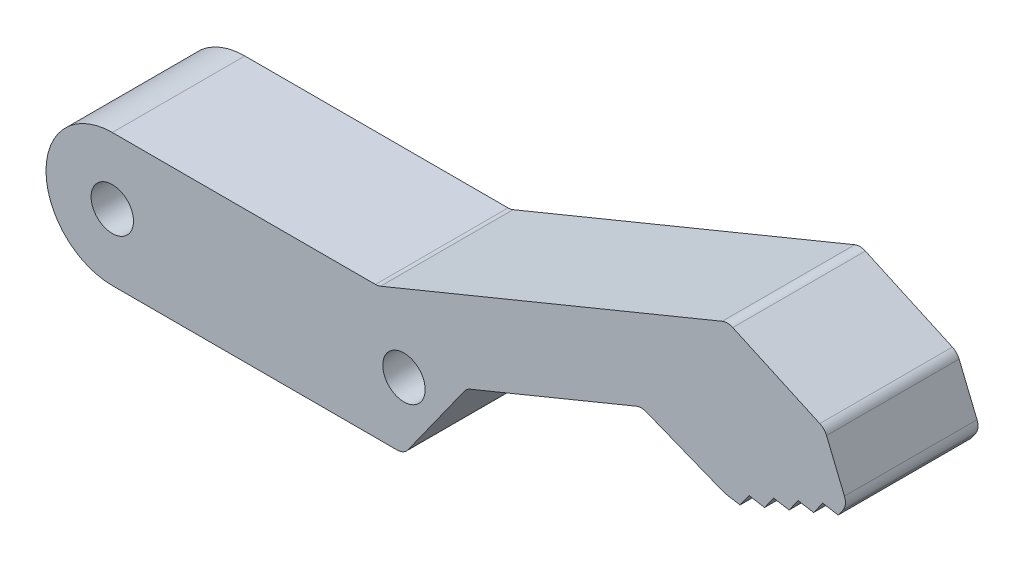
ISO-10303-21;
HEADER;
FILE_DESCRIPTION(('STEP AP214'),'2;1');
FILE_NAME('part.step','',(''),(''),'','','');
FILE_SCHEMA(('AUTOMOTIVE_DESIGN { 1 0 10303 214 1 1 1 1 }'));
ENDSEC;
DATA;
#1=APPLICATION_CONTEXT('core data for automotive mechanical design processes');
#2=APPLICATION_PROTOCOL_DEFINITION('international standard','automotive_design',2000,#1);
#3=PRODUCT_CONTEXT('',#1,'mechanical');
#4=PRODUCT('Part','Part','',(#3));
#5=PRODUCT_RELATED_PRODUCT_CATEGORY('part','',(#4));
#6=PRODUCT_DEFINITION_FORMATION('','',#4);
#7=PRODUCT_DEFINITION_CONTEXT('part definition',#1,'design');
#8=PRODUCT_DEFINITION('design','',#6,#7);
#9=PRODUCT_DEFINITION_SHAPE('','',#8);
#10=(LENGTH_UNIT() NAMED_UNIT(*) SI_UNIT(.MILLI.,.METRE.));
#11=(NAMED_UNIT(*) PLANE_ANGLE_UNIT() SI_UNIT($,.RADIAN.));
#12=(NAMED_UNIT(*) SI_UNIT($,.STERADIAN.) SOLID_ANGLE_UNIT());
#13=UNCERTAINTY_MEASURE_WITH_UNIT(LENGTH_MEASURE(1.E-05),#10,'distance_accuracy_value','');
#14=(GEOMETRIC_REPRESENTATION_CONTEXT(3) GLOBAL_UNCERTAINTY_ASSIGNED_CONTEXT((#13)) GLOBAL_UNIT_ASSIGNED_CONTEXT((#10,
#11,#12)) REPRESENTATION_CONTEXT('',''));
#15=CARTESIAN_POINT('',(0.,0.,0.));
#16=DIRECTION('',(0.,0.,1.));
#17=DIRECTION('',(1.,0.,0.));
#18=AXIS2_PLACEMENT_3D('',#15,#16,#17);
#19=CARTESIAN_POINT('',(16.9314341640704,-12.0952117619831,10.));
#20=DIRECTION('',(0.813703233651604,-0.581280523968353,0.));
#21=DIRECTION('',(0.581280523968353,0.813703233651604,0.));
#22=AXIS2_PLACEMENT_3D('',#19,#20,#21);
#23=PLANE('',#22);
#24=DIRECTION('',(-0.581280523968353,-0.813703233651604,0.));
#25=VECTOR('',#24,1.);
#26=CARTESIAN_POINT('',(16.9314341640704,-12.0952117619831,0.));
#27=LINE('',#26,#25);
#28=CARTESIAN_POINT('',(26.562618493048,1.38696338278467,0.));
#29=VERTEX_POINT('',#28);
#30=CARTESIAN_POINT('',(22.2991182366711,-4.58128052396835,0.));
#31=VERTEX_POINT('',#30);
#32=EDGE_CURVE('E320',#29,#31,#27,.T.);
#33=ORIENTED_EDGE('',*,*,#32,.F.);
#34=DIRECTION('',(0.,0.,-1.));
#35=VECTOR('',#34,1.);
#36=CARTESIAN_POINT('',(26.562618493048,1.38696338278467,10.));
#37=LINE('',#36,#35);
#38=CARTESIAN_POINT('',(26.562618493048,1.38696338278467,10.));
#39=VERTEX_POINT('',#38);
#40=EDGE_CURVE('E306',#29,#39,#37,.F.);
#41=ORIENTED_EDGE('',*,*,#40,.T.);
#42=DIRECTION('',(-0.581280523968353,-0.813703233651604,0.));
#43=VECTOR('',#42,1.);
#44=CARTESIAN_POINT('',(16.9314341640704,-12.0952117619831,10.));
#45=LINE('',#44,#43);
#46=CARTESIAN_POINT('',(22.2991182366711,-4.58128052396835,10.));
#47=VERTEX_POINT('',#46);
#48=EDGE_CURVE('E338',#39,#47,#45,.T.);
#49=ORIENTED_EDGE('',*,*,#48,.T.);
#50=DIRECTION('',(0.,0.,-1.));
#51=VECTOR('',#50,1.);
#52=CARTESIAN_POINT('',(22.2991182366711,-4.58128052396835,0.));
#53=LINE('',#52,#51);
#54=EDGE_CURVE('E303',#47,#31,#53,.T.);
#55=ORIENTED_EDGE('',*,*,#54,.T.);
#56=EDGE_LOOP('',(#33,#41,#49,#55));
#57=FACE_BOUND('',#56,.T.);
#58=ADVANCED_FACE('F39',(#57),#23,.T.);
#59=CARTESIAN_POINT('',(3.29500338314039,-8.01412070884607,10.));
#60=DIRECTION('',(0.380263412733207,-0.924878228166549,0.));
#61=DIRECTION('',(0.924878228166549,0.380263412733207,0.));
#62=AXIS2_PLACEMENT_3D('',#59,#60,#61);
#63=PLANE('',#62);
#64=DIRECTION('',(-0.924878228166549,-0.380263412733207,0.));
#65=VECTOR('',#64,1.);
#66=CARTESIAN_POINT('',(3.29500338314039,-8.01412070884607,0.));
#67=LINE('',#66,#65);
#68=CARTESIAN_POINT('',(39.5264893293259,6.88244413040183,0.));
#69=VERTEX_POINT('',#68);
#70=CARTESIAN_POINT('',(26.9960583139664,1.73056108698286,0.));
#71=VERTEX_POINT('',#70);
#72=EDGE_CURVE('E322',#69,#71,#67,.T.);
#73=ORIENTED_EDGE('',*,*,#72,.F.);
#74=DIRECTION('',(0.,0.,-1.));
#75=VECTOR('',#74,1.);
#76=CARTESIAN_POINT('',(39.5264893293259,6.88244413040184,10.));
#77=LINE('',#76,#75);
#78=CARTESIAN_POINT('',(39.5264893293259,6.88244413040183,10.));
#79=VERTEX_POINT('',#78);
#80=EDGE_CURVE('E301',#69,#79,#77,.F.);
#81=ORIENTED_EDGE('',*,*,#80,.T.);
#82=DIRECTION('',(-0.924878228166549,-0.380263412733207,0.));
#83=VECTOR('',#82,1.);
#84=CARTESIAN_POINT('',(3.29500338314039,-8.01412070884607,10.));
#85=LINE('',#84,#83);
#86=CARTESIAN_POINT('',(26.9960583139664,1.73056108698286,10.));
#87=VERTEX_POINT('',#86);
#88=EDGE_CURVE('E336',#79,#87,#85,.T.);
#89=ORIENTED_EDGE('',*,*,#88,.T.);
#90=DIRECTION('',(0.,0.,-1.));
#91=VECTOR('',#90,1.);
#92=CARTESIAN_POINT('',(26.9960583139664,1.73056108698286,0.));
#93=LINE('',#92,#91);
#94=EDGE_CURVE('E298',#87,#71,#93,.T.);
#95=ORIENTED_EDGE('',*,*,#94,.T.);
#96=EDGE_LOOP('',(#73,#81,#89,#95));
#97=FACE_BOUND('',#96,.T.);
#98=ADVANCED_FACE('F340',(#97),#63,.T.);
#99=CARTESIAN_POINT('',(7.84369243763637,19.7605066346556,10.));
#100=DIRECTION('',(-0.368935795459582,-0.929454882621317,0.));
#101=DIRECTION('',(0.929454882621317,-0.368935795459582,0.));
#102=AXIS2_PLACEMENT_3D('',#99,#100,#101);
#103=PLANE('',#102);
#104=DIRECTION('',(-0.929454882621317,0.368935795459582,0.));
#105=VECTOR('',#104,1.);
#106=CARTESIAN_POINT('',(7.84369243763637,19.7605066346556,0.));
#107=LINE('',#106,#105);
#108=CARTESIAN_POINT('',(46.0908425261849,4.57876623410547,0.));
#109=VERTEX_POINT('',#108);
#110=CARTESIAN_POINT('',(40.2756885375187,6.8870207848566,0.));
#111=VERTEX_POINT('',#110);
#112=EDGE_CURVE('E389',#109,#111,#107,.T.);
#113=ORIENTED_EDGE('',*,*,#112,.F.);
#114=DIRECTION('',(0.,0.,-1.));
#115=VECTOR('',#114,1.);
#116=CARTESIAN_POINT('',(46.0908425261848,4.57876623410547,10.));
#117=LINE('',#116,#115);
#118=CARTESIAN_POINT('',(46.0908425261849,4.57876623410547,10.));
#119=VERTEX_POINT('',#118);
#120=EDGE_CURVE('E267',#109,#119,#117,.F.);
#121=ORIENTED_EDGE('',*,*,#120,.T.);
#122=DIRECTION('',(-0.929454882621317,0.368935795459582,0.));
#123=VECTOR('',#122,1.);
#124=CARTESIAN_POINT('',(7.84369243763637,19.7605066346556,10.));
#125=LINE('',#124,#123);
#126=CARTESIAN_POINT('',(40.2756885375187,6.8870207848566,10.));
#127=VERTEX_POINT('',#126);
#128=EDGE_CURVE('E232',#119,#127,#125,.T.);
#129=ORIENTED_EDGE('',*,*,#128,.T.);
#130=DIRECTION('',(0.,0.,-1.));
#131=VECTOR('',#130,1.);
#132=CARTESIAN_POINT('',(40.2756885375187,6.8870207848566,0.));
#133=LINE('',#132,#131);
#134=EDGE_CURVE('E264',#127,#111,#133,.T.);
#135=ORIENTED_EDGE('',*,*,#134,.T.);
#136=EDGE_LOOP('',(#113,#121,#129,#135));
#137=FACE_BOUND('',#136,.T.);
#138=ADVANCED_FACE('F537',(#137),#103,.T.);
#139=CARTESIAN_POINT('',(2.04998063607053,12.0493696274544,10.));
#140=DIRECTION('',(0.167721751487352,0.985834374567054,0.));
#141=DIRECTION('',(-0.985834374567054,0.167721751487352,0.));
#142=AXIS2_PLACEMENT_3D('',#139,#140,#141);
#143=PLANE('',#142);
#144=DIRECTION('',(0.985834374567054,-0.167721751487352,0.));
#145=VECTOR('',#144,1.);
#146=CARTESIAN_POINT('',(2.04998063607053,12.0493696274544,10.));
#147=LINE('',#146,#145);
#148=CARTESIAN_POINT('',(46.2920565701571,4.52238674215974,10.));
#149=VERTEX_POINT('',#148);
#150=CARTESIAN_POINT('',(47.3510308865052,4.3422215625919,10.));
#151=VERTEX_POINT('',#150);
#152=EDGE_CURVE('E219',#149,#151,#147,.T.);
#153=ORIENTED_EDGE('',*,*,#152,.F.);
#154=DIRECTION('',(0.,0.,-1.));
#155=VECTOR('',#154,1.);
#156=CARTESIAN_POINT('',(46.2920565701571,4.52238674215974,0.));
#157=LINE('',#156,#155);
#158=CARTESIAN_POINT('',(46.2920565701571,4.52238674215974,0.));
#159=VERTEX_POINT('',#158);
#160=EDGE_CURVE('E247',#149,#159,#157,.T.);
#161=ORIENTED_EDGE('',*,*,#160,.T.);
#162=DIRECTION('',(0.985834374567054,-0.167721751487352,0.));
#163=VECTOR('',#162,1.);
#164=CARTESIAN_POINT('',(2.04998063607053,12.0493696274544,0.));
#165=LINE('',#164,#163);
#166=CARTESIAN_POINT('',(47.3510308865052,4.3422215625919,0.));
#167=VERTEX_POINT('',#166);
#168=EDGE_CURVE('E245',#159,#167,#165,.T.);
#169=ORIENTED_EDGE('',*,*,#168,.T.);
#170=DIRECTION('',(0.,0.,-1.));
#171=VECTOR('',#170,1.);
#172=CARTESIAN_POINT('',(47.3510308865052,4.3422215625919,10.));
#173=LINE('',#172,#171);
#174=EDGE_CURVE('E238',#151,#167,#173,.T.);
#175=ORIENTED_EDGE('',*,*,#174,.F.);
#176=EDGE_LOOP('',(#153,#161,#169,#175));
#177=FACE_BOUND('',#176,.T.);
#178=ADVANCED_FACE('F243',(#177),#143,.F.);
#179=CARTESIAN_POINT('',(29.2140395089282,-20.9496267653803,10.));
#180=DIRECTION('',(-0.812647209633238,0.582755963225871,0.));
#181=DIRECTION('',(-0.582755963225871,-0.812647209633238,0.));
#182=AXIS2_PLACEMENT_3D('',#179,#180,#181);
#183=PLANE('',#182);
#184=DIRECTION('',(0.582755963225871,0.812647209633238,0.));
#185=VECTOR('',#184,1.);
#186=CARTESIAN_POINT('',(29.2140395089282,-20.9496267653803,0.));
#187=LINE('',#186,#185);
#188=CARTESIAN_POINT('',(48.0382444817135,5.3005338679292,0.));
#189=VERTEX_POINT('',#188);
#190=EDGE_CURVE('E393',#167,#189,#187,.T.);
#191=ORIENTED_EDGE('',*,*,#190,.T.);
#192=DIRECTION('',(0.,0.,-1.));
#193=VECTOR('',#192,1.);
#194=CARTESIAN_POINT('',(48.0382444817135,5.3005338679292,10.));
#195=LINE('',#194,#193);
#196=CARTESIAN_POINT('',(48.0382444817135,5.3005338679292,10.));
#197=VERTEX_POINT('',#196);
#198=EDGE_CURVE('E240',#197,#189,#195,.T.);
#199=ORIENTED_EDGE('',*,*,#198,.F.);
#200=DIRECTION('',(0.582755963225871,0.812647209633238,0.));
#201=VECTOR('',#200,1.);
#202=CARTESIAN_POINT('',(29.2140395089282,-20.9496267653803,10.));
#203=LINE('',#202,#201);
#204=EDGE_CURVE('E224',#151,#197,#203,.T.);
#205=ORIENTED_EDGE('',*,*,#204,.F.);
#206=ORIENTED_EDGE('',*,*,#174,.T.);
#207=EDGE_LOOP('',(#191,#199,#205,#206));
#208=FACE_BOUND('',#207,.T.);
#209=ADVANCED_FACE('F237',(#208),#183,.F.);
#210=CARTESIAN_POINT('',(2.22776533707793,13.0943519745326,10.));
#211=DIRECTION('',(0.167721751487345,0.985834374567055,0.));
#212=DIRECTION('',(-0.985834374567056,0.167721751487345,0.));
#213=AXIS2_PLACEMENT_3D('',#210,#211,#212);
#214=PLANE('',#213);
#215=DIRECTION('',(0.985834374567055,-0.167721751487345,0.));
#216=VECTOR('',#215,1.);
#217=CARTESIAN_POINT('',(2.22776533707793,13.0943519745326,0.));
#218=LINE('',#217,#216);
#219=CARTESIAN_POINT('',(49.2007873428382,5.10274838805831,0.));
#220=VERTEX_POINT('',#219);
#221=EDGE_CURVE('E395',#189,#220,#218,.T.);
#222=ORIENTED_EDGE('',*,*,#221,.T.);
#223=DIRECTION('',(0.,0.,-1.));
#224=VECTOR('',#223,1.);
#225=CARTESIAN_POINT('',(49.2007873428382,5.10274838805831,10.));
#226=LINE('',#225,#224);
#227=CARTESIAN_POINT('',(49.2007873428382,5.10274838805831,10.));
#228=VERTEX_POINT('',#227);
#229=EDGE_CURVE('E251',#228,#220,#226,.T.);
#230=ORIENTED_EDGE('',*,*,#229,.F.);
#231=DIRECTION('',(0.985834374567055,-0.167721751487345,0.));
#232=VECTOR('',#231,1.);
#233=CARTESIAN_POINT('',(2.22776533707793,13.0943519745326,10.));
#234=LINE('',#233,#232);
#235=EDGE_CURVE('E241',#197,#228,#234,.T.);
#236=ORIENTED_EDGE('',*,*,#235,.F.);
#237=ORIENTED_EDGE('',*,*,#198,.T.);
#238=EDGE_LOOP('',(#222,#230,#236,#237));
#239=FACE_BOUND('',#238,.T.);
#240=ADVANCED_FACE('F462',(#239),#214,.F.);
#241=CARTESIAN_POINT('',(30.0754438283324,-21.5673468509608,10.));
#242=DIRECTION('',(-0.812647209633237,0.582755963225872,0.));
#243=DIRECTION('',(-0.582755963225872,-0.812647209633237,0.));
#244=AXIS2_PLACEMENT_3D('',#241,#242,#243);
#245=PLANE('',#244);
#246=DIRECTION('',(0.582755963225872,0.812647209633237,0.));
#247=VECTOR('',#246,1.);
#248=CARTESIAN_POINT('',(30.0754438283324,-21.5673468509608,0.));
#249=LINE('',#248,#247);
#250=CARTESIAN_POINT('',(49.8880009380465,6.06106069339562,0.));
#251=VERTEX_POINT('',#250);
#252=EDGE_CURVE('E398',#220,#251,#249,.T.);
#253=ORIENTED_EDGE('',*,*,#252,.T.);
#254=DIRECTION('',(0.,0.,-1.));
#255=VECTOR('',#254,1.);
#256=CARTESIAN_POINT('',(49.8880009380465,6.06106069339562,10.));
#257=LINE('',#256,#255);
#258=CARTESIAN_POINT('',(49.8880009380465,6.06106069339562,10.));
#259=VERTEX_POINT('',#258);
#260=EDGE_CURVE('E454',#259,#251,#257,.T.);
#261=ORIENTED_EDGE('',*,*,#260,.F.);
#262=DIRECTION('',(0.582755963225872,0.812647209633237,0.));
#263=VECTOR('',#262,1.);
#264=CARTESIAN_POINT('',(30.0754438283324,-21.5673468509608,10.));
#265=LINE('',#264,#263);
#266=EDGE_CURVE('E350',#228,#259,#265,.T.);
#267=ORIENTED_EDGE('',*,*,#266,.F.);
#268=ORIENTED_EDGE('',*,*,#229,.T.);
#269=EDGE_LOOP('',(#253,#261,#267,#268));
#270=FACE_BOUND('',#269,.T.);
#271=ADVANCED_FACE('F459',(#270),#245,.F.);
#272=CARTESIAN_POINT('',(2.40555003808549,14.1393343216111,10.));
#273=DIRECTION('',(0.167721751487346,0.985834374567055,0.));
#274=DIRECTION('',(-0.985834374567055,0.167721751487346,0.));
#275=AXIS2_PLACEMENT_3D('',#272,#273,#274);
#276=PLANE('',#275);
#277=DIRECTION('',(0.985834374567055,-0.167721751487346,0.));
#278=VECTOR('',#277,1.);
#279=CARTESIAN_POINT('',(2.40555003808549,14.1393343216111,0.));
#280=LINE('',#279,#278);
#281=CARTESIAN_POINT('',(51.0505437991714,5.86327521352473,0.));
#282=VERTEX_POINT('',#281);
#283=EDGE_CURVE('E401',#251,#282,#280,.T.);
#284=ORIENTED_EDGE('',*,*,#283,.T.);
#285=DIRECTION('',(0.,0.,-1.));
#286=VECTOR('',#285,1.);
#287=CARTESIAN_POINT('',(51.0505437991714,5.86327521352473,10.));
#288=LINE('',#287,#286);
#289=CARTESIAN_POINT('',(51.0505437991714,5.86327521352473,10.));
#290=VERTEX_POINT('',#289);
#291=EDGE_CURVE('E451',#290,#282,#288,.T.);
#292=ORIENTED_EDGE('',*,*,#291,.F.);
#293=DIRECTION('',(0.985834374567055,-0.167721751487346,0.));
#294=VECTOR('',#293,1.);
#295=CARTESIAN_POINT('',(2.40555003808549,14.1393343216111,10.));
#296=LINE('',#295,#294);
#297=EDGE_CURVE('E353',#259,#290,#296,.T.);
#298=ORIENTED_EDGE('',*,*,#297,.F.);
#299=ORIENTED_EDGE('',*,*,#260,.T.);
#300=EDGE_LOOP('',(#284,#292,#298,#299));
#301=FACE_BOUND('',#300,.T.);
#302=ADVANCED_FACE('F465',(#301),#276,.F.);
#303=CARTESIAN_POINT('',(30.9368481477369,-22.1850669365412,10.));
#304=DIRECTION('',(-0.812647209633239,0.582755963225869,0.));
#305=DIRECTION('',(-0.582755963225869,-0.812647209633239,0.));
#306=AXIS2_PLACEMENT_3D('',#303,#304,#305);
#307=PLANE('',#306);
#308=DIRECTION('',(0.582755963225869,0.812647209633239,0.));
#309=VECTOR('',#308,1.);
#310=CARTESIAN_POINT('',(30.9368481477369,-22.1850669365412,0.));
#311=LINE('',#310,#309);
#312=CARTESIAN_POINT('',(51.7377573943796,6.82158751886203,0.));
#313=VERTEX_POINT('',#312);
#314=EDGE_CURVE('E404',#282,#313,#311,.T.);
#315=ORIENTED_EDGE('',*,*,#314,.T.);
#316=DIRECTION('',(0.,0.,-1.));
#317=VECTOR('',#316,1.);
#318=CARTESIAN_POINT('',(51.7377573943796,6.82158751886203,10.));
#319=LINE('',#318,#317);
#320=CARTESIAN_POINT('',(51.7377573943796,6.82158751886203,10.));
#321=VERTEX_POINT('',#320);
#322=EDGE_CURVE('E448',#321,#313,#319,.T.);
#323=ORIENTED_EDGE('',*,*,#322,.F.);
#324=DIRECTION('',(0.582755963225869,0.812647209633239,0.));
#325=VECTOR('',#324,1.);
#326=CARTESIAN_POINT('',(30.9368481477369,-22.1850669365412,10.));
#327=LINE('',#326,#325);
#328=EDGE_CURVE('E356',#290,#321,#327,.T.);
#329=ORIENTED_EDGE('',*,*,#328,.F.);
#330=ORIENTED_EDGE('',*,*,#291,.T.);
#331=EDGE_LOOP('',(#315,#323,#329,#330));
#332=FACE_BOUND('',#331,.T.);
#333=ADVANCED_FACE('F469',(#332),#307,.F.);
#334=CARTESIAN_POINT('',(2.58333473909304,15.1843166686896,10.));
#335=DIRECTION('',(0.167721751487346,0.985834374567055,0.));
#336=DIRECTION('',(-0.985834374567055,0.167721751487346,0.));
#337=AXIS2_PLACEMENT_3D('',#334,#335,#336);
#338=PLANE('',#337);
#339=DIRECTION('',(0.985834374567055,-0.167721751487346,0.));
#340=VECTOR('',#339,1.);
#341=CARTESIAN_POINT('',(2.58333473909304,15.1843166686896,0.));
#342=LINE('',#341,#340);
#343=CARTESIAN_POINT('',(52.9003002555045,6.62380203899114,0.));
#344=VERTEX_POINT('',#343);
#345=EDGE_CURVE('E407',#313,#344,#342,.T.);
#346=ORIENTED_EDGE('',*,*,#345,.T.);
#347=DIRECTION('',(0.,0.,-1.));
#348=VECTOR('',#347,1.);
#349=CARTESIAN_POINT('',(52.9003002555045,6.62380203899114,10.));
#350=LINE('',#349,#348);
#351=CARTESIAN_POINT('',(52.9003002555045,6.62380203899114,10.));
#352=VERTEX_POINT('',#351);
#353=EDGE_CURVE('E445',#352,#344,#350,.T.);
#354=ORIENTED_EDGE('',*,*,#353,.F.);
#355=DIRECTION('',(0.985834374567055,-0.167721751487346,0.));
#356=VECTOR('',#355,1.);
#357=CARTESIAN_POINT('',(2.58333473909304,15.1843166686896,10.));
#358=LINE('',#357,#356);
#359=EDGE_CURVE('E359',#321,#352,#358,.T.);
#360=ORIENTED_EDGE('',*,*,#359,.F.);
#361=ORIENTED_EDGE('',*,*,#322,.T.);
#362=EDGE_LOOP('',(#346,#354,#360,#361));
#363=FACE_BOUND('',#362,.T.);
#364=ADVANCED_FACE('F471',(#363),#338,.F.);
#365=CARTESIAN_POINT('',(31.7982524671406,-22.8027870221219,10.));
#366=DIRECTION('',(-0.812647209633232,0.582755963225879,0.));
#367=DIRECTION('',(-0.582755963225879,-0.812647209633232,0.));
#368=AXIS2_PLACEMENT_3D('',#365,#366,#367);
#369=PLANE('',#368);
#370=DIRECTION('',(0.582755963225879,0.812647209633232,0.));
#371=VECTOR('',#370,1.);
#372=CARTESIAN_POINT('',(31.7982524671406,-22.8027870221219,0.));
#373=LINE('',#372,#371);
#374=CARTESIAN_POINT('',(53.5875138507128,7.58211434432844,0.));
#375=VERTEX_POINT('',#374);
#376=EDGE_CURVE('E410',#344,#375,#373,.T.);
#377=ORIENTED_EDGE('',*,*,#376,.T.);
#378=DIRECTION('',(0.,0.,-1.));
#379=VECTOR('',#378,1.);
#380=CARTESIAN_POINT('',(53.5875138507128,7.58211434432844,10.));
#381=LINE('',#380,#379);
#382=CARTESIAN_POINT('',(53.5875138507128,7.58211434432844,10.));
#383=VERTEX_POINT('',#382);
#384=EDGE_CURVE('E442',#383,#375,#381,.T.);
#385=ORIENTED_EDGE('',*,*,#384,.F.);
#386=DIRECTION('',(0.582755963225879,0.812647209633232,0.));
#387=VECTOR('',#386,1.);
#388=CARTESIAN_POINT('',(31.7982524671406,-22.8027870221219,10.));
#389=LINE('',#388,#387);
#390=EDGE_CURVE('E362',#352,#383,#389,.T.);
#391=ORIENTED_EDGE('',*,*,#390,.F.);
#392=ORIENTED_EDGE('',*,*,#353,.T.);
#393=EDGE_LOOP('',(#377,#385,#391,#392));
#394=FACE_BOUND('',#393,.T.);
#395=ADVANCED_FACE('F473',(#394),#369,.F.);
#396=CARTESIAN_POINT('',(2.7611194401007,16.2292990157683,10.));
#397=DIRECTION('',(0.167721751487351,0.985834374567054,0.));
#398=DIRECTION('',(-0.985834374567054,0.167721751487351,0.));
#399=AXIS2_PLACEMENT_3D('',#396,#397,#398);
#400=PLANE('',#399);
#401=DIRECTION('',(0.985834374567055,-0.167721751487351,0.));
#402=VECTOR('',#401,1.);
#403=CARTESIAN_POINT('',(2.7611194401007,16.2292990157683,0.));
#404=LINE('',#403,#402);
#405=CARTESIAN_POINT('',(54.7500567118375,7.38432886445755,0.));
#406=VERTEX_POINT('',#405);
#407=EDGE_CURVE('E413',#375,#406,#404,.T.);
#408=ORIENTED_EDGE('',*,*,#407,.T.);
#409=DIRECTION('',(0.,0.,-1.));
#410=VECTOR('',#409,1.);
#411=CARTESIAN_POINT('',(54.7500567118375,7.38432886445755,10.));
#412=LINE('',#411,#410);
#413=CARTESIAN_POINT('',(54.7500567118375,7.38432886445755,10.));
#414=VERTEX_POINT('',#413);
#415=EDGE_CURVE('E439',#414,#406,#412,.T.);
#416=ORIENTED_EDGE('',*,*,#415,.F.);
#417=DIRECTION('',(0.985834374567055,-0.167721751487351,0.));
#418=VECTOR('',#417,1.);
#419=CARTESIAN_POINT('',(2.7611194401007,16.2292990157683,10.));
#420=LINE('',#419,#418);
#421=EDGE_CURVE('E365',#383,#414,#420,.T.);
#422=ORIENTED_EDGE('',*,*,#421,.F.);
#423=ORIENTED_EDGE('',*,*,#384,.T.);
#424=EDGE_LOOP('',(#408,#416,#422,#423));
#425=FACE_BOUND('',#424,.T.);
#426=ADVANCED_FACE('F478',(#425),#400,.F.);
#427=CARTESIAN_POINT('',(32.6596567865455,-23.4205071077022,10.));
#428=DIRECTION('',(-0.812647209633238,0.58275596322587,0.));
#429=DIRECTION('',(-0.58275596322587,-0.812647209633238,0.));
#430=AXIS2_PLACEMENT_3D('',#427,#428,#429);
#431=PLANE('',#430);
#432=DIRECTION('',(0.58275596322587,0.812647209633238,0.));
#433=VECTOR('',#432,1.);
#434=CARTESIAN_POINT('',(32.6596567865455,-23.4205071077022,0.));
#435=LINE('',#434,#433);
#436=CARTESIAN_POINT('',(55.1142791888537,7.89223337047834,0.));
#437=VERTEX_POINT('',#436);
#438=EDGE_CURVE('E416',#406,#437,#435,.T.);
#439=ORIENTED_EDGE('',*,*,#438,.T.);
#440=DIRECTION('',(0.,0.,-1.));
#441=VECTOR('',#440,1.);
#442=CARTESIAN_POINT('',(55.1142791888537,7.89223337047834,10.));
#443=LINE('',#442,#441);
#444=CARTESIAN_POINT('',(55.1142791888537,7.89223337047834,10.));
#445=VERTEX_POINT('',#444);
#446=EDGE_CURVE('E283',#437,#445,#443,.F.);
#447=ORIENTED_EDGE('',*,*,#446,.T.);
#448=DIRECTION('',(0.58275596322587,0.812647209633238,0.));
#449=VECTOR('',#448,1.);
#450=CARTESIAN_POINT('',(32.6596567865455,-23.4205071077022,10.));
#451=LINE('',#450,#449);
#452=EDGE_CURVE('E368',#414,#445,#451,.T.);
#453=ORIENTED_EDGE('',*,*,#452,.F.);
#454=ORIENTED_EDGE('',*,*,#415,.T.);
#455=EDGE_LOOP('',(#439,#447,#453,#454));
#456=FACE_BOUND('',#455,.T.);
#457=ADVANCED_FACE('F480',(#456),#431,.F.);
#458=CARTESIAN_POINT('',(50.3551112402657,20.7034892439219,10.));
#459=DIRECTION('',(0.924878228166549,0.380263412733207,0.));
#460=DIRECTION('',(-0.380263412733207,0.924878228166549,0.));
#461=AXIS2_PLACEMENT_3D('',#458,#459,#460);
#462=PLANE('',#461);
#463=DIRECTION('',(0.380263412733207,-0.924878228166549,0.));
#464=VECTOR('',#463,1.);
#465=CARTESIAN_POINT('',(50.3551112402657,20.7034892439219,10.));
#466=LINE('',#465,#464);
#467=CARTESIAN_POINT('',(53.8764912996726,12.138774256918,10.));
#468=VERTEX_POINT('',#467);
#469=CARTESIAN_POINT('',(55.226510207387,8.85525274643741,10.));
#470=VERTEX_POINT('',#469);
#471=EDGE_CURVE('E371',#468,#470,#466,.T.);
#472=ORIENTED_EDGE('',*,*,#471,.T.);
#473=DIRECTION('',(0.,0.,-1.));
#474=VECTOR('',#473,1.);
#475=CARTESIAN_POINT('',(55.226510207387,8.85525274643742,0.));
#476=LINE('',#475,#474);
#477=CARTESIAN_POINT('',(55.226510207387,8.85525274643741,0.));
#478=VERTEX_POINT('',#477);
#479=EDGE_CURVE('E280',#470,#478,#476,.T.);
#480=ORIENTED_EDGE('',*,*,#479,.T.);
#481=DIRECTION('',(0.380263412733207,-0.924878228166549,0.));
#482=VECTOR('',#481,1.);
#483=CARTESIAN_POINT('',(50.3551112402657,20.7034892439219,0.));
#484=LINE('',#483,#482);
#485=CARTESIAN_POINT('',(53.8764912996726,12.138774256918,0.));
#486=VERTEX_POINT('',#485);
#487=EDGE_CURVE('E419',#486,#478,#484,.T.);
#488=ORIENTED_EDGE('',*,*,#487,.F.);
#489=DIRECTION('',(0.,0.,-1.));
#490=VECTOR('',#489,1.);
#491=CARTESIAN_POINT('',(53.8764912996726,12.138774256918,10.));
#492=LINE('',#491,#490);
#493=EDGE_CURVE('E278',#486,#468,#492,.F.);
#494=ORIENTED_EDGE('',*,*,#493,.T.);
#495=EDGE_LOOP('',(#472,#480,#488,#494));
#496=FACE_BOUND('',#495,.T.);
#497=ADVANCED_FACE('F488',(#496),#462,.T.);
#498=CARTESIAN_POINT('',(13.9488099268582,30.6231164748253,10.));
#499=DIRECTION('',(0.414522259932085,0.910039172794664,0.));
#500=DIRECTION('',(-0.910039172794664,0.414522259932085,0.));
#501=AXIS2_PLACEMENT_3D('',#498,#499,#500);
#502=PLANE('',#501);
#503=DIRECTION('',(0.910039172794664,-0.414522259932085,0.));
#504=VECTOR('',#503,1.);
#505=CARTESIAN_POINT('',(13.9488099268582,30.6231164748253,10.));
#506=LINE('',#505,#504);
#507=CARTESIAN_POINT('',(46.8032086062433,15.6579589338968,10.));
#508=VERTEX_POINT('',#507);
#509=CARTESIAN_POINT('',(53.3661353314382,12.6685500169795,10.));
#510=VERTEX_POINT('',#509);
#511=EDGE_CURVE('E374',#508,#510,#506,.T.);
#512=ORIENTED_EDGE('',*,*,#511,.T.);
#513=DIRECTION('',(0.,0.,-1.));
#514=VECTOR('',#513,1.);
#515=CARTESIAN_POINT('',(53.3661353314382,12.6685500169795,10.));
#516=LINE('',#515,#514);
#517=CARTESIAN_POINT('',(53.3661353314382,12.6685500169795,0.));
#518=VERTEX_POINT('',#517);
#519=EDGE_CURVE('E287',#510,#518,#516,.T.);
#520=ORIENTED_EDGE('',*,*,#519,.T.);
#521=DIRECTION('',(0.910039172794664,-0.414522259932085,0.));
#522=VECTOR('',#521,1.);
#523=CARTESIAN_POINT('',(13.9488099268582,30.6231164748253,0.));
#524=LINE('',#523,#522);
#525=CARTESIAN_POINT('',(46.8032086062433,15.6579589338968,0.));
#526=VERTEX_POINT('',#525);
#527=EDGE_CURVE('E422',#526,#518,#524,.T.);
#528=ORIENTED_EDGE('',*,*,#527,.F.);
#529=DIRECTION('',(0.,0.,-1.));
#530=VECTOR('',#529,1.);
#531=CARTESIAN_POINT('',(46.8032086062433,15.6579589338968,10.));
#532=LINE('',#531,#530);
#533=EDGE_CURVE('E285',#526,#508,#532,.F.);
#534=ORIENTED_EDGE('',*,*,#533,.T.);
#535=EDGE_LOOP('',(#512,#520,#528,#534));
#536=FACE_BOUND('',#535,.T.);
#537=ADVANCED_FACE('F497',(#536),#502,.T.);
#538=CARTESIAN_POINT('',(1.14074851739701,-2.77453321099285,10.));
#539=DIRECTION('',(-0.380263412733206,0.924878228166549,0.));
#540=DIRECTION('',(-0.924878228166549,-0.380263412733206,0.));
#541=AXIS2_PLACEMENT_3D('',#538,#539,#540);
#542=PLANE('',#541);
#543=DIRECTION('',(0.924878228166549,0.380263412733206,0.));
#544=VECTOR('',#543,1.);
#545=CARTESIAN_POINT('',(1.14074851739701,-2.77453321099285,10.));
#546=LINE('',#545,#544);
#547=CARTESIAN_POINT('',(20.2327114807882,5.07512177183345,10.));
#548=VERTEX_POINT('',#547);
#549=CARTESIAN_POINT('',(46.0084229335781,15.6727979892687,10.));
#550=VERTEX_POINT('',#549);
#551=EDGE_CURVE('E377',#548,#550,#546,.T.);
#552=ORIENTED_EDGE('',*,*,#551,.T.);
#553=DIRECTION('',(0.,0.,-1.));
#554=VECTOR('',#553,1.);
#555=CARTESIAN_POINT('',(46.0084229335781,15.6727979892687,10.));
#556=LINE('',#555,#554);
#557=CARTESIAN_POINT('',(46.0084229335781,15.6727979892687,0.));
#558=VERTEX_POINT('',#557);
#559=EDGE_CURVE('E292',#550,#558,#556,.T.);
#560=ORIENTED_EDGE('',*,*,#559,.T.);
#561=DIRECTION('',(0.924878228166549,0.380263412733206,0.));
#562=VECTOR('',#561,1.);
#563=CARTESIAN_POINT('',(1.14074851739701,-2.77453321099285,0.));
#564=LINE('',#563,#562);
#565=CARTESIAN_POINT('',(20.2327114807882,5.07512177183345,0.));
#566=VERTEX_POINT('',#565);
#567=EDGE_CURVE('E425',#566,#558,#564,.T.);
#568=ORIENTED_EDGE('',*,*,#567,.F.);
#569=DIRECTION('',(0.,0.,-1.));
#570=VECTOR('',#569,1.);
#571=CARTESIAN_POINT('',(20.2327114807882,5.07512177183345,10.));
#572=LINE('',#571,#570);
#573=EDGE_CURVE('E290',#566,#548,#572,.F.);
#574=ORIENTED_EDGE('',*,*,#573,.T.);
#575=EDGE_LOOP('',(#552,#560,#568,#574));
#576=FACE_BOUND('',#575,.T.);
#577=ADVANCED_FACE('F504',(#576),#542,.T.);
#578=CARTESIAN_POINT('',(0.,5.,10.));
#579=DIRECTION('',(0.,1.,0.));
#580=DIRECTION('',(0.,0.,1.));
#581=AXIS2_PLACEMENT_3D('',#578,#579,#580);
#582=PLANE('',#581);
#583=DIRECTION('',(1.,0.,0.));
#584=VECTOR('',#583,1.);
#585=CARTESIAN_POINT('',(0.,5.,10.));
#586=LINE('',#585,#584);
#587=CARTESIAN_POINT('',(0.,5.,10.));
#588=VERTEX_POINT('',#587);
#589=CARTESIAN_POINT('',(19.852448068055,5.,10.));
#590=VERTEX_POINT('',#589);
#591=EDGE_CURVE('E380',#588,#590,#586,.T.);
#592=ORIENTED_EDGE('',*,*,#591,.T.);
#593=DIRECTION('',(0.,0.,-1.));
#594=VECTOR('',#593,1.);
#595=CARTESIAN_POINT('',(19.852448068055,5.,0.));
#596=LINE('',#595,#594);
#597=CARTESIAN_POINT('',(19.852448068055,5.,0.));
#598=VERTEX_POINT('',#597);
#599=EDGE_CURVE('E295',#590,#598,#596,.T.);
#600=ORIENTED_EDGE('',*,*,#599,.T.);
#601=DIRECTION('',(1.,0.,0.));
#602=VECTOR('',#601,1.);
#603=CARTESIAN_POINT('',(0.,5.,0.));
#604=LINE('',#603,#602);
#605=CARTESIAN_POINT('',(0.,5.,0.));
#606=VERTEX_POINT('',#605);
#607=EDGE_CURVE('E428',#606,#598,#604,.T.);
#608=ORIENTED_EDGE('',*,*,#607,.F.);
#609=DIRECTION('',(0.,0.,-1.));
#610=VECTOR('',#609,1.);
#611=CARTESIAN_POINT('',(0.,5.,10.));
#612=LINE('',#611,#610);
#613=EDGE_CURVE('E437',#588,#606,#612,.T.);
#614=ORIENTED_EDGE('',*,*,#613,.F.);
#615=EDGE_LOOP('',(#592,#600,#608,#614));
#616=FACE_BOUND('',#615,.T.);
#617=ADVANCED_FACE('F512',(#616),#582,.T.);
#618=CARTESIAN_POINT('',(0.,0.,10.));
#619=DIRECTION('',(0.,0.,-1.));
#620=DIRECTION('',(-1.,0.,0.));
#621=AXIS2_PLACEMENT_3D('',#618,#619,#620);
#622=CYLINDRICAL_SURFACE('',#621,5.);
#623=CARTESIAN_POINT('',(0.,0.,0.));
#624=DIRECTION('',(0.,0.,1.));
#625=DIRECTION('',(1.,0.,0.));
#626=AXIS2_PLACEMENT_3D('',#623,#624,#625);
#627=CIRCLE('',#626,5.);
#628=CARTESIAN_POINT('',(0.,-5.,0.));
#629=VERTEX_POINT('',#628);
#630=EDGE_CURVE('E431',#606,#629,#627,.T.);
#631=ORIENTED_EDGE('',*,*,#630,.T.);
#632=DIRECTION('',(0.,0.,-1.));
#633=VECTOR('',#632,1.);
#634=CARTESIAN_POINT('',(0.,-5.,10.));
#635=LINE('',#634,#633);
#636=CARTESIAN_POINT('',(0.,-5.,10.));
#637=VERTEX_POINT('',#636);
#638=EDGE_CURVE('E386',#637,#629,#635,.T.);
#639=ORIENTED_EDGE('',*,*,#638,.F.);
#640=CARTESIAN_POINT('',(0.,0.,10.));
#641=DIRECTION('',(0.,0.,1.));
#642=DIRECTION('',(1.,0.,0.));
#643=AXIS2_PLACEMENT_3D('',#640,#641,#642);
#644=CIRCLE('',#643,5.);
#645=EDGE_CURVE('E382',#588,#637,#644,.T.);
#646=ORIENTED_EDGE('',*,*,#645,.F.);
#647=ORIENTED_EDGE('',*,*,#613,.T.);
#648=EDGE_LOOP('',(#631,#639,#646,#647));
#649=FACE_BOUND('',#648,.T.);
#650=ADVANCED_FACE('F516',(#649),#622,.T.);
#651=CARTESIAN_POINT('',(0.,-5.,10.));
#652=DIRECTION('',(0.,1.,0.));
#653=DIRECTION('',(0.,0.,1.));
#654=AXIS2_PLACEMENT_3D('',#651,#652,#653);
#655=PLANE('',#654);
#656=DIRECTION('',(1.,0.,0.));
#657=VECTOR('',#656,1.);
#658=CARTESIAN_POINT('',(0.,-5.,0.));
#659=LINE('',#658,#657);
#660=CARTESIAN_POINT('',(21.4854150030195,-5.,0.));
#661=VERTEX_POINT('',#660);
#662=EDGE_CURVE('E345',#629,#661,#659,.T.);
#663=ORIENTED_EDGE('',*,*,#662,.T.);
#664=DIRECTION('',(0.,0.,-1.));
#665=VECTOR('',#664,1.);
#666=CARTESIAN_POINT('',(21.4854150030195,-5.,10.));
#667=LINE('',#666,#665);
#668=CARTESIAN_POINT('',(21.4854150030195,-5.,10.));
#669=VERTEX_POINT('',#668);
#670=EDGE_CURVE('E54',#661,#669,#667,.F.);
#671=ORIENTED_EDGE('',*,*,#670,.T.);
#672=DIRECTION('',(1.,0.,0.));
#673=VECTOR('',#672,1.);
#674=CARTESIAN_POINT('',(0.,-5.,10.));
#675=LINE('',#674,#673);
#676=EDGE_CURVE('E385',#637,#669,#675,.T.);
#677=ORIENTED_EDGE('',*,*,#676,.F.);
#678=ORIENTED_EDGE('',*,*,#638,.T.);
#679=EDGE_LOOP('',(#663,#671,#677,#678));
#680=FACE_BOUND('',#679,.T.);
#681=ADVANCED_FACE('F520',(#680),#655,.F.);
#682=CARTESIAN_POINT('',(0.,0.,10.));
#683=DIRECTION('',(0.,0.,1.));
#684=DIRECTION('',(1.,0.,0.));
#685=AXIS2_PLACEMENT_3D('',#682,#683,#684);
#686=PLANE('',#685);
#687=CARTESIAN_POINT('',(0.,0.,10.));
#688=DIRECTION('',(0.,0.,1.));
#689=DIRECTION('',(1.,0.,0.));
#690=AXIS2_PLACEMENT_3D('',#687,#688,#689);
#691=CIRCLE('',#690,1.59999999999999);
#692=CARTESIAN_POINT('',(1.59999999999999,0.,10.));
#693=VERTEX_POINT('',#692);
#694=EDGE_CURVE('E588',#693,#693,#691,.T.);
#695=ORIENTED_EDGE('',*,*,#694,.F.);
#696=EDGE_LOOP('',(#695));
#697=FACE_BOUND('',#696,.T.);
#698=CARTESIAN_POINT('',(22.,0.,10.));
#699=DIRECTION('',(0.,0.,1.));
#700=DIRECTION('',(1.,0.,0.));
#701=AXIS2_PLACEMENT_3D('',#698,#699,#700);
#702=CIRCLE('',#701,1.59999999999999);
#703=CARTESIAN_POINT('',(23.6,0.,10.));
#704=VERTEX_POINT('',#703);
#705=EDGE_CURVE('E583',#704,#704,#702,.T.);
#706=ORIENTED_EDGE('',*,*,#705,.F.);
#707=EDGE_LOOP('',(#706));
#708=FACE_BOUND('',#707,.T.);
#709=ORIENTED_EDGE('',*,*,#128,.F.);
#710=CARTESIAN_POINT('',(46.4597783216444,5.50822111672679,10.));
#711=DIRECTION('',(0.,0.,1.));
#712=DIRECTION('',(1.,0.,0.));
#713=AXIS2_PLACEMENT_3D('',#710,#711,#712);
#714=CIRCLE('',#713,1.);
#715=EDGE_CURVE('E227',#119,#149,#714,.T.);
#716=ORIENTED_EDGE('',*,*,#715,.T.);
#717=ORIENTED_EDGE('',*,*,#152,.T.);
#718=ORIENTED_EDGE('',*,*,#204,.T.);
#719=ORIENTED_EDGE('',*,*,#235,.T.);
#720=ORIENTED_EDGE('',*,*,#266,.T.);
#721=ORIENTED_EDGE('',*,*,#297,.T.);
#722=ORIENTED_EDGE('',*,*,#328,.T.);
#723=ORIENTED_EDGE('',*,*,#359,.T.);
#724=ORIENTED_EDGE('',*,*,#390,.T.);
#725=ORIENTED_EDGE('',*,*,#421,.T.);
#726=ORIENTED_EDGE('',*,*,#452,.T.);
#727=CARTESIAN_POINT('',(54.3016319792205,8.47498933370421,10.));
#728=DIRECTION('',(0.,0.,1.));
#729=DIRECTION('',(1.,0.,0.));
#730=AXIS2_PLACEMENT_3D('',#727,#728,#729);
#731=CIRCLE('',#730,1.);
#732=EDGE_CURVE('E275',#445,#470,#731,.T.);
#733=ORIENTED_EDGE('',*,*,#732,.T.);
#734=ORIENTED_EDGE('',*,*,#471,.F.);
#735=CARTESIAN_POINT('',(52.9516130715061,11.7585108441848,10.));
#736=DIRECTION('',(0.,0.,1.));
#737=DIRECTION('',(1.,0.,0.));
#738=AXIS2_PLACEMENT_3D('',#735,#736,#737);
#739=CIRCLE('',#738,1.);
#740=EDGE_CURVE('E273',#468,#510,#739,.T.);
#741=ORIENTED_EDGE('',*,*,#740,.T.);
#742=ORIENTED_EDGE('',*,*,#511,.F.);
#743=CARTESIAN_POINT('',(46.3886863463113,14.7479197611021,10.));
#744=DIRECTION('',(0.,0.,1.));
#745=DIRECTION('',(1.,0.,0.));
#746=AXIS2_PLACEMENT_3D('',#743,#744,#745);
#747=CIRCLE('',#746,1.);
#748=EDGE_CURVE('E271',#508,#550,#747,.T.);
#749=ORIENTED_EDGE('',*,*,#748,.T.);
#750=ORIENTED_EDGE('',*,*,#551,.F.);
#751=CARTESIAN_POINT('',(19.852448068055,6.,10.));
#752=DIRECTION('',(0.,0.,1.));
#753=DIRECTION('',(1.,0.,0.));
#754=AXIS2_PLACEMENT_3D('',#751,#752,#753);
#755=CIRCLE('',#754,1.);
#756=EDGE_CURVE('E62',#548,#590,#755,.F.);
#757=ORIENTED_EDGE('',*,*,#756,.T.);
#758=ORIENTED_EDGE('',*,*,#591,.F.);
#759=ORIENTED_EDGE('',*,*,#645,.T.);
#760=ORIENTED_EDGE('',*,*,#676,.T.);
#761=CARTESIAN_POINT('',(21.4854150030195,-4.,10.));
#762=DIRECTION('',(0.,0.,1.));
#763=DIRECTION('',(1.,0.,0.));
#764=AXIS2_PLACEMENT_3D('',#761,#762,#763);
#765=CIRCLE('',#764,1.);
#766=EDGE_CURVE('E269',#669,#47,#765,.T.);
#767=ORIENTED_EDGE('',*,*,#766,.T.);
#768=ORIENTED_EDGE('',*,*,#48,.F.);
#769=CARTESIAN_POINT('',(27.3763217266996,0.805682858816315,10.));
#770=DIRECTION('',(0.,0.,1.));
#771=DIRECTION('',(1.,0.,0.));
#772=AXIS2_PLACEMENT_3D('',#769,#770,#771);
#773=CIRCLE('',#772,1.);
#774=EDGE_CURVE('E11',#39,#87,#773,.F.);
#775=ORIENTED_EDGE('',*,*,#774,.T.);
#776=ORIENTED_EDGE('',*,*,#88,.F.);
#777=CARTESIAN_POINT('',(39.9067527420591,5.95756590223529,10.));
#778=DIRECTION('',(0.,0.,1.));
#779=DIRECTION('',(1.,0.,0.));
#780=AXIS2_PLACEMENT_3D('',#777,#778,#779);
#781=CIRCLE('',#780,1.);
#782=EDGE_CURVE('E314',#79,#127,#781,.F.);
#783=ORIENTED_EDGE('',*,*,#782,.T.);
#784=EDGE_LOOP('',(#709,#716,#717,#718,#719,#720,#721,#722,#723,#724,#725,#726,#733,#734,#741,
#742,#749,#750,#757,#758,#759,#760,#767,#768,#775,#776,#783));
#785=FACE_BOUND('',#784,.T.);
#786=ADVANCED_FACE('F222',(#697,#708,#785),#686,.T.);
#787=CARTESIAN_POINT('',(0.,0.,0.));
#788=DIRECTION('',(0.,0.,1.));
#789=DIRECTION('',(1.,0.,0.));
#790=AXIS2_PLACEMENT_3D('',#787,#788,#789);
#791=PLANE('',#790);
#792=CARTESIAN_POINT('',(0.,0.,0.));
#793=DIRECTION('',(0.,0.,1.));
#794=DIRECTION('',(1.,0.,0.));
#795=AXIS2_PLACEMENT_3D('',#792,#793,#794);
#796=CIRCLE('',#795,1.6);
#797=CARTESIAN_POINT('',(1.6,0.,0.));
#798=VERTEX_POINT('',#797);
#799=EDGE_CURVE('E581',#798,#798,#796,.T.);
#800=ORIENTED_EDGE('',*,*,#799,.T.);
#801=EDGE_LOOP('',(#800));
#802=FACE_BOUND('',#801,.T.);
#803=CARTESIAN_POINT('',(22.,0.,0.));
#804=DIRECTION('',(0.,0.,1.));
#805=DIRECTION('',(1.,0.,0.));
#806=AXIS2_PLACEMENT_3D('',#803,#804,#805);
#807=CIRCLE('',#806,1.6);
#808=CARTESIAN_POINT('',(23.6,0.,0.));
#809=VERTEX_POINT('',#808);
#810=EDGE_CURVE('E330',#809,#809,#807,.T.);
#811=ORIENTED_EDGE('',*,*,#810,.T.);
#812=EDGE_LOOP('',(#811));
#813=FACE_BOUND('',#812,.T.);
#814=ORIENTED_EDGE('',*,*,#168,.F.);
#815=CARTESIAN_POINT('',(46.4597783216444,5.50822111672679,0.));
#816=DIRECTION('',(0.,0.,1.));
#817=DIRECTION('',(1.,0.,0.));
#818=AXIS2_PLACEMENT_3D('',#815,#816,#817);
#819=CIRCLE('',#818,1.);
#820=EDGE_CURVE('E262',#159,#109,#819,.F.);
#821=ORIENTED_EDGE('',*,*,#820,.T.);
#822=ORIENTED_EDGE('',*,*,#112,.T.);
#823=CARTESIAN_POINT('',(39.9067527420591,5.95756590223529,0.));
#824=DIRECTION('',(0.,0.,1.));
#825=DIRECTION('',(1.,0.,0.));
#826=AXIS2_PLACEMENT_3D('',#823,#824,#825);
#827=CIRCLE('',#826,1.);
#828=EDGE_CURVE('E312',#111,#69,#827,.T.);
#829=ORIENTED_EDGE('',*,*,#828,.T.);
#830=ORIENTED_EDGE('',*,*,#72,.T.);
#831=CARTESIAN_POINT('',(27.3763217266996,0.805682858816315,0.));
#832=DIRECTION('',(0.,0.,1.));
#833=DIRECTION('',(1.,0.,0.));
#834=AXIS2_PLACEMENT_3D('',#831,#832,#833);
#835=CIRCLE('',#834,1.);
#836=EDGE_CURVE('E47',#71,#29,#835,.T.);
#837=ORIENTED_EDGE('',*,*,#836,.T.);
#838=ORIENTED_EDGE('',*,*,#32,.T.);
#839=CARTESIAN_POINT('',(21.4854150030195,-4.,0.));
#840=DIRECTION('',(0.,0.,1.));
#841=DIRECTION('',(1.,0.,0.));
#842=AXIS2_PLACEMENT_3D('',#839,#840,#841);
#843=CIRCLE('',#842,1.);
#844=EDGE_CURVE('E249',#31,#661,#843,.F.);
#845=ORIENTED_EDGE('',*,*,#844,.T.);
#846=ORIENTED_EDGE('',*,*,#662,.F.);
#847=ORIENTED_EDGE('',*,*,#630,.F.);
#848=ORIENTED_EDGE('',*,*,#607,.T.);
#849=CARTESIAN_POINT('',(19.852448068055,6.,0.));
#850=DIRECTION('',(0.,0.,1.));
#851=DIRECTION('',(1.,0.,0.));
#852=AXIS2_PLACEMENT_3D('',#849,#850,#851);
#853=CIRCLE('',#852,1.);
#854=EDGE_CURVE('E309',#598,#566,#853,.T.);
#855=ORIENTED_EDGE('',*,*,#854,.T.);
#856=ORIENTED_EDGE('',*,*,#567,.T.);
#857=CARTESIAN_POINT('',(46.3886863463113,14.7479197611021,0.));
#858=DIRECTION('',(0.,0.,1.));
#859=DIRECTION('',(1.,0.,0.));
#860=AXIS2_PLACEMENT_3D('',#857,#858,#859);
#861=CIRCLE('',#860,1.);
#862=EDGE_CURVE('E256',#558,#526,#861,.F.);
#863=ORIENTED_EDGE('',*,*,#862,.T.);
#864=ORIENTED_EDGE('',*,*,#527,.T.);
#865=CARTESIAN_POINT('',(52.9516130715061,11.7585108441848,0.));
#866=DIRECTION('',(0.,0.,1.));
#867=DIRECTION('',(1.,0.,0.));
#868=AXIS2_PLACEMENT_3D('',#865,#866,#867);
#869=CIRCLE('',#868,1.);
#870=EDGE_CURVE('E258',#518,#486,#869,.F.);
#871=ORIENTED_EDGE('',*,*,#870,.T.);
#872=ORIENTED_EDGE('',*,*,#487,.T.);
#873=CARTESIAN_POINT('',(54.3016319792205,8.47498933370421,0.));
#874=DIRECTION('',(0.,0.,1.));
#875=DIRECTION('',(1.,0.,0.));
#876=AXIS2_PLACEMENT_3D('',#873,#874,#875);
#877=CIRCLE('',#876,1.);
#878=EDGE_CURVE('E260',#478,#437,#877,.F.);
#879=ORIENTED_EDGE('',*,*,#878,.T.);
#880=ORIENTED_EDGE('',*,*,#438,.F.);
#881=ORIENTED_EDGE('',*,*,#407,.F.);
#882=ORIENTED_EDGE('',*,*,#376,.F.);
#883=ORIENTED_EDGE('',*,*,#345,.F.);
#884=ORIENTED_EDGE('',*,*,#314,.F.);
#885=ORIENTED_EDGE('',*,*,#283,.F.);
#886=ORIENTED_EDGE('',*,*,#252,.F.);
#887=ORIENTED_EDGE('',*,*,#221,.F.);
#888=ORIENTED_EDGE('',*,*,#190,.F.);
#889=EDGE_LOOP('',(#814,#821,#822,#829,#830,#837,#838,#845,#846,#847,#848,#855,#856,#863,#864,
#871,#872,#879,#880,#881,#882,#883,#884,#885,#886,#887,#888));
#890=FACE_BOUND('',#889,.T.);
#891=ADVANCED_FACE('F319',(#802,#813,#890),#791,.F.);
#892=CARTESIAN_POINT('',(46.4597783216444,5.50822111672679,10.));
#893=DIRECTION('',(0.,0.,1.));
#894=DIRECTION('',(1.,0.,0.));
#895=AXIS2_PLACEMENT_3D('',#892,#893,#894);
#896=CYLINDRICAL_SURFACE('',#895,1.);
#897=ORIENTED_EDGE('',*,*,#715,.F.);
#898=ORIENTED_EDGE('',*,*,#120,.F.);
#899=ORIENTED_EDGE('',*,*,#820,.F.);
#900=ORIENTED_EDGE('',*,*,#160,.F.);
#901=EDGE_LOOP('',(#897,#898,#899,#900));
#902=FACE_BOUND('',#901,.T.);
#903=ADVANCED_FACE('F541',(#902),#896,.T.);
#904=CARTESIAN_POINT('',(54.3016319792205,8.47498933370421,10.));
#905=DIRECTION('',(0.,0.,1.));
#906=DIRECTION('',(1.,0.,0.));
#907=AXIS2_PLACEMENT_3D('',#904,#905,#906);
#908=CYLINDRICAL_SURFACE('',#907,1.);
#909=ORIENTED_EDGE('',*,*,#732,.F.);
#910=ORIENTED_EDGE('',*,*,#446,.F.);
#911=ORIENTED_EDGE('',*,*,#878,.F.);
#912=ORIENTED_EDGE('',*,*,#479,.F.);
#913=EDGE_LOOP('',(#909,#910,#911,#912));
#914=FACE_BOUND('',#913,.T.);
#915=ADVANCED_FACE('F483',(#914),#908,.T.);
#916=CARTESIAN_POINT('',(52.9516130715061,11.7585108441848,10.));
#917=DIRECTION('',(0.,0.,-1.));
#918=DIRECTION('',(-1.,0.,0.));
#919=AXIS2_PLACEMENT_3D('',#916,#917,#918);
#920=CYLINDRICAL_SURFACE('',#919,1.);
#921=ORIENTED_EDGE('',*,*,#740,.F.);
#922=ORIENTED_EDGE('',*,*,#493,.F.);
#923=ORIENTED_EDGE('',*,*,#870,.F.);
#924=ORIENTED_EDGE('',*,*,#519,.F.);
#925=EDGE_LOOP('',(#921,#922,#923,#924));
#926=FACE_BOUND('',#925,.T.);
#927=ADVANCED_FACE('F492',(#926),#920,.T.);
#928=CARTESIAN_POINT('',(46.3886863463113,14.7479197611021,10.));
#929=DIRECTION('',(0.,0.,-1.));
#930=DIRECTION('',(-1.,0.,0.));
#931=AXIS2_PLACEMENT_3D('',#928,#929,#930);
#932=CYLINDRICAL_SURFACE('',#931,1.);
#933=ORIENTED_EDGE('',*,*,#748,.F.);
#934=ORIENTED_EDGE('',*,*,#533,.F.);
#935=ORIENTED_EDGE('',*,*,#862,.F.);
#936=ORIENTED_EDGE('',*,*,#559,.F.);
#937=EDGE_LOOP('',(#933,#934,#935,#936));
#938=FACE_BOUND('',#937,.T.);
#939=ADVANCED_FACE('F501',(#938),#932,.T.);
#940=CARTESIAN_POINT('',(19.852448068055,6.,10.));
#941=DIRECTION('',(0.,0.,1.));
#942=DIRECTION('',(1.,0.,0.));
#943=AXIS2_PLACEMENT_3D('',#940,#941,#942);
#944=CYLINDRICAL_SURFACE('',#943,1.);
#945=ORIENTED_EDGE('',*,*,#756,.F.);
#946=ORIENTED_EDGE('',*,*,#573,.F.);
#947=ORIENTED_EDGE('',*,*,#854,.F.);
#948=ORIENTED_EDGE('',*,*,#599,.F.);
#949=EDGE_LOOP('',(#945,#946,#947,#948));
#950=FACE_BOUND('',#949,.T.);
#951=ADVANCED_FACE('F508',(#950),#944,.F.);
#952=CARTESIAN_POINT('',(39.9067527420591,5.95756590223529,10.));
#953=DIRECTION('',(0.,0.,1.));
#954=DIRECTION('',(1.,0.,0.));
#955=AXIS2_PLACEMENT_3D('',#952,#953,#954);
#956=CYLINDRICAL_SURFACE('',#955,1.);
#957=ORIENTED_EDGE('',*,*,#782,.F.);
#958=ORIENTED_EDGE('',*,*,#80,.F.);
#959=ORIENTED_EDGE('',*,*,#828,.F.);
#960=ORIENTED_EDGE('',*,*,#134,.F.);
#961=EDGE_LOOP('',(#957,#958,#959,#960));
#962=FACE_BOUND('',#961,.T.);
#963=ADVANCED_FACE('F553',(#962),#956,.F.);
#964=CARTESIAN_POINT('',(27.3763217266996,0.805682858816315,10.));
#965=DIRECTION('',(0.,0.,1.));
#966=DIRECTION('',(1.,0.,0.));
#967=AXIS2_PLACEMENT_3D('',#964,#965,#966);
#968=CYLINDRICAL_SURFACE('',#967,1.);
#969=ORIENTED_EDGE('',*,*,#774,.F.);
#970=ORIENTED_EDGE('',*,*,#40,.F.);
#971=ORIENTED_EDGE('',*,*,#836,.F.);
#972=ORIENTED_EDGE('',*,*,#94,.F.);
#973=EDGE_LOOP('',(#969,#970,#971,#972));
#974=FACE_BOUND('',#973,.T.);
#975=ADVANCED_FACE('F333',(#974),#968,.F.);
#976=CARTESIAN_POINT('',(21.4854150030195,-4.,10.));
#977=DIRECTION('',(0.,0.,1.));
#978=DIRECTION('',(1.,0.,0.));
#979=AXIS2_PLACEMENT_3D('',#976,#977,#978);
#980=CYLINDRICAL_SURFACE('',#979,1.);
#981=ORIENTED_EDGE('',*,*,#766,.F.);
#982=ORIENTED_EDGE('',*,*,#670,.F.);
#983=ORIENTED_EDGE('',*,*,#844,.F.);
#984=ORIENTED_EDGE('',*,*,#54,.F.);
#985=EDGE_LOOP('',(#981,#982,#983,#984));
#986=FACE_BOUND('',#985,.T.);
#987=ADVANCED_FACE('F41',(#986),#980,.T.);
#988=CARTESIAN_POINT('',(22.,0.,10.));
#989=DIRECTION('',(0.,0.,1.));
#990=DIRECTION('',(1.,0.,0.));
#991=AXIS2_PLACEMENT_3D('',#988,#989,#990);
#992=CYLINDRICAL_SURFACE('',#991,1.59999999999999);
#993=ORIENTED_EDGE('',*,*,#810,.F.);
#994=EDGE_LOOP('',(#993));
#995=FACE_BOUND('',#994,.T.);
#996=ORIENTED_EDGE('',*,*,#705,.T.);
#997=EDGE_LOOP('',(#996));
#998=FACE_BOUND('',#997,.T.);
#999=ADVANCED_FACE('F560',(#995,#998),#992,.F.);
#1000=CARTESIAN_POINT('',(0.,0.,10.));
#1001=DIRECTION('',(0.,0.,1.));
#1002=DIRECTION('',(1.,0.,0.));
#1003=AXIS2_PLACEMENT_3D('',#1000,#1001,#1002);
#1004=CYLINDRICAL_SURFACE('',#1003,1.59999999999999);
#1005=ORIENTED_EDGE('',*,*,#799,.F.);
#1006=EDGE_LOOP('',(#1005));
#1007=FACE_BOUND('',#1006,.T.);
#1008=ORIENTED_EDGE('',*,*,#694,.T.);
#1009=EDGE_LOOP('',(#1008));
#1010=FACE_BOUND('',#1009,.T.);
#1011=ADVANCED_FACE('F564',(#1007,#1010),#1004,.F.);
#1012=CLOSED_SHELL('',(#58,#98,#138,#178,#209,#240,#271,#302,#333,#364,#395,#426,#457,#497,#537,
#577,#617,#650,#681,#786,#891,#903,#915,#927,#939,#951,#963,#975,#987,#999,#1011));
#1013=MANIFOLD_SOLID_BREP('B2',#1012);
#1014=ADVANCED_BREP_SHAPE_REPRESENTATION('',(#18,#1013),#14);
#1015=SHAPE_DEFINITION_REPRESENTATION(#9,#1014);
ENDSEC;
END-ISO-10303-21;
